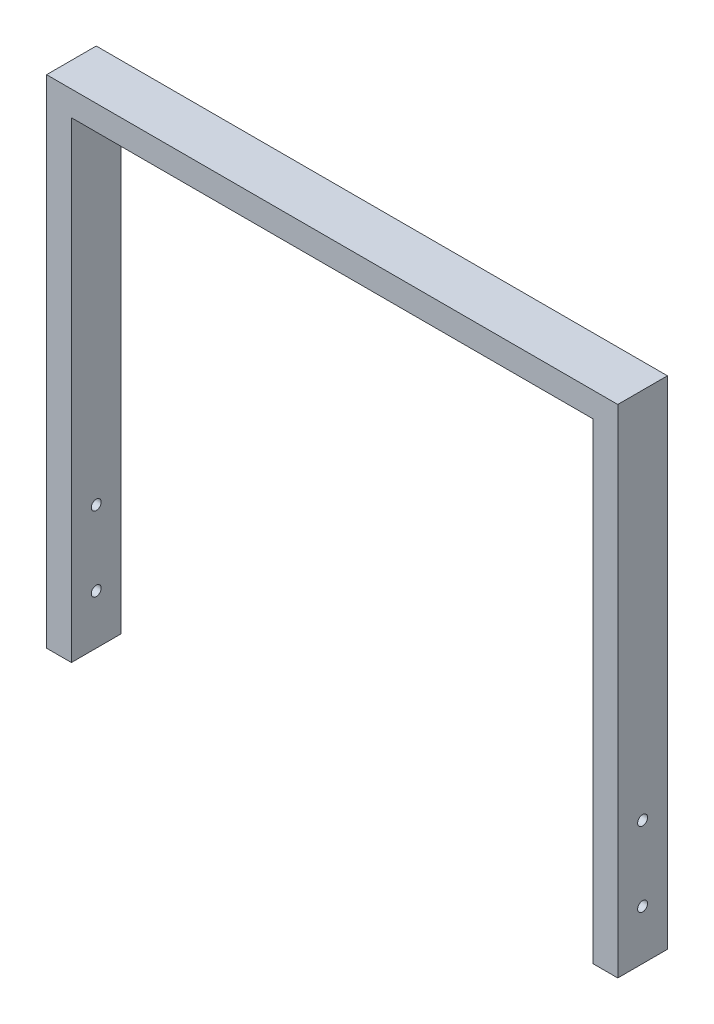
ISO-10303-21;
HEADER;
FILE_DESCRIPTION(('STEP AP214'),'2;1');
FILE_NAME('part.step','',(''),(''),'','','');
FILE_SCHEMA(('AUTOMOTIVE_DESIGN { 1 0 10303 214 1 1 1 1 }'));
ENDSEC;
DATA;
#1=APPLICATION_CONTEXT('core data for automotive mechanical design processes');
#2=APPLICATION_PROTOCOL_DEFINITION('international standard','automotive_design',2000,#1);
#3=PRODUCT_CONTEXT('',#1,'mechanical');
#4=PRODUCT('Part','Part','',(#3));
#5=PRODUCT_RELATED_PRODUCT_CATEGORY('part','',(#4));
#6=PRODUCT_DEFINITION_FORMATION('','',#4);
#7=PRODUCT_DEFINITION_CONTEXT('part definition',#1,'design');
#8=PRODUCT_DEFINITION('design','',#6,#7);
#9=PRODUCT_DEFINITION_SHAPE('','',#8);
#10=(LENGTH_UNIT() NAMED_UNIT(*) SI_UNIT(.MILLI.,.METRE.));
#11=(NAMED_UNIT(*) PLANE_ANGLE_UNIT() SI_UNIT($,.RADIAN.));
#12=(NAMED_UNIT(*) SI_UNIT($,.STERADIAN.) SOLID_ANGLE_UNIT());
#13=UNCERTAINTY_MEASURE_WITH_UNIT(LENGTH_MEASURE(1.E-05),#10,'distance_accuracy_value','');
#14=(GEOMETRIC_REPRESENTATION_CONTEXT(3) GLOBAL_UNCERTAINTY_ASSIGNED_CONTEXT((#13)) GLOBAL_UNIT_ASSIGNED_CONTEXT((#10,
#11,#12)) REPRESENTATION_CONTEXT('',''));
#15=CARTESIAN_POINT('',(0.,0.,0.));
#16=DIRECTION('',(0.,0.,1.));
#17=DIRECTION('',(1.,0.,0.));
#18=AXIS2_PLACEMENT_3D('',#15,#16,#17);
#19=CARTESIAN_POINT('',(10.,0.,10.));
#20=DIRECTION('',(0.,1.,0.));
#21=DIRECTION('',(-1.,0.,0.));
#22=AXIS2_PLACEMENT_3D('',#19,#20,#21);
#23=PLANE('',#22);
#24=DIRECTION('',(1.,0.,0.));
#25=VECTOR('',#24,1.);
#26=CARTESIAN_POINT('',(10.,0.,-10.));
#27=LINE('',#26,#25);
#28=CARTESIAN_POINT('',(0.,0.,-10.));
#29=VERTEX_POINT('',#28);
#30=CARTESIAN_POINT('',(10.,0.,-10.));
#31=VERTEX_POINT('',#30);
#32=EDGE_CURVE('E143',#29,#31,#27,.T.);
#33=ORIENTED_EDGE('',*,*,#32,.T.);
#34=DIRECTION('',(0.,0.,-1.));
#35=VECTOR('',#34,1.);
#36=CARTESIAN_POINT('',(10.,0.,10.));
#37=LINE('',#36,#35);
#38=CARTESIAN_POINT('',(10.,0.,10.));
#39=VERTEX_POINT('',#38);
#40=EDGE_CURVE('E11',#39,#31,#37,.T.);
#41=ORIENTED_EDGE('',*,*,#40,.F.);
#42=DIRECTION('',(1.,0.,0.));
#43=VECTOR('',#42,1.);
#44=CARTESIAN_POINT('',(10.,0.,10.));
#45=LINE('',#44,#43);
#46=CARTESIAN_POINT('',(0.,0.,10.));
#47=VERTEX_POINT('',#46);
#48=EDGE_CURVE('E166',#47,#39,#45,.T.);
#49=ORIENTED_EDGE('',*,*,#48,.F.);
#50=DIRECTION('',(0.,0.,-1.));
#51=VECTOR('',#50,1.);
#52=CARTESIAN_POINT('',(0.,0.,10.));
#53=LINE('',#52,#51);
#54=EDGE_CURVE('E139',#47,#29,#53,.T.);
#55=ORIENTED_EDGE('',*,*,#54,.T.);
#56=EDGE_LOOP('',(#33,#41,#49,#55));
#57=FACE_BOUND('',#56,.T.);
#58=ADVANCED_FACE('F42',(#57),#23,.F.);
#59=CARTESIAN_POINT('',(9.99999999999998,190.,10.));
#60=DIRECTION('',(-1.,0.,0.));
#61=DIRECTION('',(0.,-1.,0.));
#62=AXIS2_PLACEMENT_3D('',#59,#60,#61);
#63=PLANE('',#62);
#64=CARTESIAN_POINT('',(10.,20.,0.));
#65=DIRECTION('',(-1.,0.,0.));
#66=DIRECTION('',(0.,-1.,0.));
#67=AXIS2_PLACEMENT_3D('',#64,#65,#66);
#68=CIRCLE('',#67,2.);
#69=CARTESIAN_POINT('',(10.,20.,2.));
#70=VERTEX_POINT('',#69);
#71=EDGE_CURVE('E148',#70,#70,#68,.T.);
#72=ORIENTED_EDGE('',*,*,#71,.T.);
#73=EDGE_LOOP('',(#72));
#74=FACE_BOUND('',#73,.T.);
#75=CARTESIAN_POINT('',(10.,50.,0.));
#76=DIRECTION('',(-1.,0.,0.));
#77=DIRECTION('',(0.,-1.,0.));
#78=AXIS2_PLACEMENT_3D('',#75,#76,#77);
#79=CIRCLE('',#78,2.);
#80=CARTESIAN_POINT('',(10.,50.,2.));
#81=VERTEX_POINT('',#80);
#82=EDGE_CURVE('E217',#81,#81,#79,.T.);
#83=ORIENTED_EDGE('',*,*,#82,.T.);
#84=EDGE_LOOP('',(#83));
#85=FACE_BOUND('',#84,.T.);
#86=DIRECTION('',(0.,1.,0.));
#87=VECTOR('',#86,1.);
#88=CARTESIAN_POINT('',(9.99999999999998,190.,-10.));
#89=LINE('',#88,#87);
#90=CARTESIAN_POINT('',(9.99999999999998,190.,-10.));
#91=VERTEX_POINT('',#90);
#92=EDGE_CURVE('E147',#31,#91,#89,.T.);
#93=ORIENTED_EDGE('',*,*,#92,.T.);
#94=DIRECTION('',(0.,0.,-1.));
#95=VECTOR('',#94,1.);
#96=CARTESIAN_POINT('',(9.99999999999998,190.,10.));
#97=LINE('',#96,#95);
#98=CARTESIAN_POINT('',(9.99999999999998,190.,10.));
#99=VERTEX_POINT('',#98);
#100=EDGE_CURVE('E51',#99,#91,#97,.T.);
#101=ORIENTED_EDGE('',*,*,#100,.F.);
#102=DIRECTION('',(0.,1.,0.));
#103=VECTOR('',#102,1.);
#104=CARTESIAN_POINT('',(9.99999999999998,190.,10.));
#105=LINE('',#104,#103);
#106=EDGE_CURVE('E102',#39,#99,#105,.T.);
#107=ORIENTED_EDGE('',*,*,#106,.F.);
#108=ORIENTED_EDGE('',*,*,#40,.T.);
#109=EDGE_LOOP('',(#93,#101,#107,#108));
#110=FACE_BOUND('',#109,.T.);
#111=ADVANCED_FACE('F270',(#74,#85,#110),#63,.F.);
#112=CARTESIAN_POINT('',(220.,190.,10.));
#113=DIRECTION('',(0.,1.,0.));
#114=DIRECTION('',(-1.,0.,0.));
#115=AXIS2_PLACEMENT_3D('',#112,#113,#114);
#116=PLANE('',#115);
#117=DIRECTION('',(1.,0.,0.));
#118=VECTOR('',#117,1.);
#119=CARTESIAN_POINT('',(220.,190.,-10.));
#120=LINE('',#119,#118);
#121=CARTESIAN_POINT('',(220.,190.,-10.));
#122=VERTEX_POINT('',#121);
#123=EDGE_CURVE('E151',#91,#122,#120,.T.);
#124=ORIENTED_EDGE('',*,*,#123,.T.);
#125=DIRECTION('',(0.,0.,-1.));
#126=VECTOR('',#125,1.);
#127=CARTESIAN_POINT('',(220.,190.,10.));
#128=LINE('',#127,#126);
#129=CARTESIAN_POINT('',(220.,190.,10.));
#130=VERTEX_POINT('',#129);
#131=EDGE_CURVE('E177',#130,#122,#128,.T.);
#132=ORIENTED_EDGE('',*,*,#131,.F.);
#133=DIRECTION('',(1.,0.,0.));
#134=VECTOR('',#133,1.);
#135=CARTESIAN_POINT('',(220.,190.,10.));
#136=LINE('',#135,#134);
#137=EDGE_CURVE('E187',#99,#130,#136,.T.);
#138=ORIENTED_EDGE('',*,*,#137,.F.);
#139=ORIENTED_EDGE('',*,*,#100,.T.);
#140=EDGE_LOOP('',(#124,#132,#138,#139));
#141=FACE_BOUND('',#140,.T.);
#142=ADVANCED_FACE('F185',(#141),#116,.F.);
#143=CARTESIAN_POINT('',(220.,0.,10.));
#144=DIRECTION('',(1.,0.,0.));
#145=DIRECTION('',(0.,0.,-1.));
#146=AXIS2_PLACEMENT_3D('',#143,#144,#145);
#147=PLANE('',#146);
#148=CARTESIAN_POINT('',(220.,20.,0.));
#149=DIRECTION('',(1.,0.,0.));
#150=DIRECTION('',(0.,0.,-1.));
#151=AXIS2_PLACEMENT_3D('',#148,#149,#150);
#152=CIRCLE('',#151,2.);
#153=CARTESIAN_POINT('',(220.,20.,2.));
#154=VERTEX_POINT('',#153);
#155=EDGE_CURVE('E213',#154,#154,#152,.T.);
#156=ORIENTED_EDGE('',*,*,#155,.T.);
#157=EDGE_LOOP('',(#156));
#158=FACE_BOUND('',#157,.T.);
#159=CARTESIAN_POINT('',(220.,50.,0.));
#160=DIRECTION('',(1.,0.,0.));
#161=DIRECTION('',(0.,0.,-1.));
#162=AXIS2_PLACEMENT_3D('',#159,#160,#161);
#163=CIRCLE('',#162,2.);
#164=CARTESIAN_POINT('',(220.,50.,2.));
#165=VERTEX_POINT('',#164);
#166=EDGE_CURVE('E221',#165,#165,#163,.T.);
#167=ORIENTED_EDGE('',*,*,#166,.T.);
#168=EDGE_LOOP('',(#167));
#169=FACE_BOUND('',#168,.T.);
#170=DIRECTION('',(0.,-1.,0.));
#171=VECTOR('',#170,1.);
#172=CARTESIAN_POINT('',(220.,0.,-10.));
#173=LINE('',#172,#171);
#174=CARTESIAN_POINT('',(220.,0.,-10.));
#175=VERTEX_POINT('',#174);
#176=EDGE_CURVE('E154',#122,#175,#173,.T.);
#177=ORIENTED_EDGE('',*,*,#176,.T.);
#178=DIRECTION('',(0.,0.,-1.));
#179=VECTOR('',#178,1.);
#180=CARTESIAN_POINT('',(220.,0.,10.));
#181=LINE('',#180,#179);
#182=CARTESIAN_POINT('',(220.,0.,10.));
#183=VERTEX_POINT('',#182);
#184=EDGE_CURVE('E173',#183,#175,#181,.T.);
#185=ORIENTED_EDGE('',*,*,#184,.F.);
#186=DIRECTION('',(0.,-1.,0.));
#187=VECTOR('',#186,1.);
#188=CARTESIAN_POINT('',(220.,0.,10.));
#189=LINE('',#188,#187);
#190=EDGE_CURVE('E200',#130,#183,#189,.T.);
#191=ORIENTED_EDGE('',*,*,#190,.F.);
#192=ORIENTED_EDGE('',*,*,#131,.T.);
#193=EDGE_LOOP('',(#177,#185,#191,#192));
#194=FACE_BOUND('',#193,.T.);
#195=ADVANCED_FACE('F195',(#158,#169,#194),#147,.F.);
#196=CARTESIAN_POINT('',(230.,0.,10.));
#197=DIRECTION('',(0.,1.,0.));
#198=DIRECTION('',(-1.,0.,0.));
#199=AXIS2_PLACEMENT_3D('',#196,#197,#198);
#200=PLANE('',#199);
#201=DIRECTION('',(1.,0.,0.));
#202=VECTOR('',#201,1.);
#203=CARTESIAN_POINT('',(230.,0.,-10.));
#204=LINE('',#203,#202);
#205=CARTESIAN_POINT('',(230.,0.,-10.));
#206=VERTEX_POINT('',#205);
#207=EDGE_CURVE('E157',#175,#206,#204,.T.);
#208=ORIENTED_EDGE('',*,*,#207,.T.);
#209=DIRECTION('',(0.,0.,-1.));
#210=VECTOR('',#209,1.);
#211=CARTESIAN_POINT('',(230.,0.,10.));
#212=LINE('',#211,#210);
#213=CARTESIAN_POINT('',(230.,0.,10.));
#214=VERTEX_POINT('',#213);
#215=EDGE_CURVE('E132',#214,#206,#212,.T.);
#216=ORIENTED_EDGE('',*,*,#215,.F.);
#217=DIRECTION('',(1.,0.,0.));
#218=VECTOR('',#217,1.);
#219=CARTESIAN_POINT('',(230.,0.,10.));
#220=LINE('',#219,#218);
#221=EDGE_CURVE('E121',#183,#214,#220,.T.);
#222=ORIENTED_EDGE('',*,*,#221,.F.);
#223=ORIENTED_EDGE('',*,*,#184,.T.);
#224=EDGE_LOOP('',(#208,#216,#222,#223));
#225=FACE_BOUND('',#224,.T.);
#226=ADVANCED_FACE('F198',(#225),#200,.F.);
#227=CARTESIAN_POINT('',(230.,200.,10.));
#228=DIRECTION('',(-1.,0.,0.));
#229=DIRECTION('',(0.,-1.,0.));
#230=AXIS2_PLACEMENT_3D('',#227,#228,#229);
#231=PLANE('',#230);
#232=CARTESIAN_POINT('',(230.,20.,0.));
#233=DIRECTION('',(-1.,0.,0.));
#234=DIRECTION('',(0.,0.,1.));
#235=AXIS2_PLACEMENT_3D('',#232,#233,#234);
#236=CIRCLE('',#235,2.);
#237=CARTESIAN_POINT('',(230.,20.,2.));
#238=VERTEX_POINT('',#237);
#239=EDGE_CURVE('E225',#238,#238,#236,.T.);
#240=ORIENTED_EDGE('',*,*,#239,.T.);
#241=EDGE_LOOP('',(#240));
#242=FACE_BOUND('',#241,.T.);
#243=CARTESIAN_POINT('',(230.,50.,0.));
#244=DIRECTION('',(-1.,0.,0.));
#245=DIRECTION('',(0.,0.,1.));
#246=AXIS2_PLACEMENT_3D('',#243,#244,#245);
#247=CIRCLE('',#246,2.);
#248=CARTESIAN_POINT('',(230.,50.,2.));
#249=VERTEX_POINT('',#248);
#250=EDGE_CURVE('E226',#249,#249,#247,.T.);
#251=ORIENTED_EDGE('',*,*,#250,.T.);
#252=EDGE_LOOP('',(#251));
#253=FACE_BOUND('',#252,.T.);
#254=DIRECTION('',(0.,1.,0.));
#255=VECTOR('',#254,1.);
#256=CARTESIAN_POINT('',(230.,200.,-10.));
#257=LINE('',#256,#255);
#258=CARTESIAN_POINT('',(230.,200.,-10.));
#259=VERTEX_POINT('',#258);
#260=EDGE_CURVE('E130',#206,#259,#257,.T.);
#261=ORIENTED_EDGE('',*,*,#260,.T.);
#262=DIRECTION('',(0.,0.,-1.));
#263=VECTOR('',#262,1.);
#264=CARTESIAN_POINT('',(230.,200.,10.));
#265=LINE('',#264,#263);
#266=CARTESIAN_POINT('',(230.,200.,10.));
#267=VERTEX_POINT('',#266);
#268=EDGE_CURVE('E127',#267,#259,#265,.T.);
#269=ORIENTED_EDGE('',*,*,#268,.F.);
#270=DIRECTION('',(0.,1.,0.));
#271=VECTOR('',#270,1.);
#272=CARTESIAN_POINT('',(230.,200.,10.));
#273=LINE('',#272,#271);
#274=EDGE_CURVE('E115',#214,#267,#273,.T.);
#275=ORIENTED_EDGE('',*,*,#274,.F.);
#276=ORIENTED_EDGE('',*,*,#215,.T.);
#277=EDGE_LOOP('',(#261,#269,#275,#276));
#278=FACE_BOUND('',#277,.T.);
#279=ADVANCED_FACE('F128',(#242,#253,#278),#231,.F.);
#280=CARTESIAN_POINT('',(0.,200.,10.));
#281=DIRECTION('',(0.,-1.,0.));
#282=DIRECTION('',(0.,0.,-1.));
#283=AXIS2_PLACEMENT_3D('',#280,#281,#282);
#284=PLANE('',#283);
#285=DIRECTION('',(-1.,0.,0.));
#286=VECTOR('',#285,1.);
#287=CARTESIAN_POINT('',(0.,200.,-10.));
#288=LINE('',#287,#286);
#289=CARTESIAN_POINT('',(0.,200.,-10.));
#290=VERTEX_POINT('',#289);
#291=EDGE_CURVE('E88',#259,#290,#288,.T.);
#292=ORIENTED_EDGE('',*,*,#291,.T.);
#293=DIRECTION('',(0.,0.,-1.));
#294=VECTOR('',#293,1.);
#295=CARTESIAN_POINT('',(0.,200.,10.));
#296=LINE('',#295,#294);
#297=CARTESIAN_POINT('',(0.,200.,10.));
#298=VERTEX_POINT('',#297);
#299=EDGE_CURVE('E133',#298,#290,#296,.T.);
#300=ORIENTED_EDGE('',*,*,#299,.F.);
#301=DIRECTION('',(-1.,0.,0.));
#302=VECTOR('',#301,1.);
#303=CARTESIAN_POINT('',(0.,200.,10.));
#304=LINE('',#303,#302);
#305=EDGE_CURVE('E119',#267,#298,#304,.T.);
#306=ORIENTED_EDGE('',*,*,#305,.F.);
#307=ORIENTED_EDGE('',*,*,#268,.T.);
#308=EDGE_LOOP('',(#292,#300,#306,#307));
#309=FACE_BOUND('',#308,.T.);
#310=ADVANCED_FACE('F135',(#309),#284,.F.);
#311=CARTESIAN_POINT('',(0.,0.,10.));
#312=DIRECTION('',(1.,0.,0.));
#313=DIRECTION('',(0.,0.,-1.));
#314=AXIS2_PLACEMENT_3D('',#311,#312,#313);
#315=PLANE('',#314);
#316=CARTESIAN_POINT('',(0.,20.,0.));
#317=DIRECTION('',(-1.,0.,0.));
#318=DIRECTION('',(0.,0.,1.));
#319=AXIS2_PLACEMENT_3D('',#316,#317,#318);
#320=CIRCLE('',#319,2.);
#321=CARTESIAN_POINT('',(0.,20.,2.));
#322=VERTEX_POINT('',#321);
#323=EDGE_CURVE('E234',#322,#322,#320,.T.);
#324=ORIENTED_EDGE('',*,*,#323,.F.);
#325=EDGE_LOOP('',(#324));
#326=FACE_BOUND('',#325,.T.);
#327=CARTESIAN_POINT('',(0.,50.,0.));
#328=DIRECTION('',(-1.,0.,0.));
#329=DIRECTION('',(0.,0.,1.));
#330=AXIS2_PLACEMENT_3D('',#327,#328,#329);
#331=CIRCLE('',#330,2.);
#332=CARTESIAN_POINT('',(0.,50.,2.));
#333=VERTEX_POINT('',#332);
#334=EDGE_CURVE('E230',#333,#333,#331,.T.);
#335=ORIENTED_EDGE('',*,*,#334,.F.);
#336=EDGE_LOOP('',(#335));
#337=FACE_BOUND('',#336,.T.);
#338=DIRECTION('',(0.,-1.,0.));
#339=VECTOR('',#338,1.);
#340=CARTESIAN_POINT('',(0.,0.,-10.));
#341=LINE('',#340,#339);
#342=EDGE_CURVE('E94',#290,#29,#341,.T.);
#343=ORIENTED_EDGE('',*,*,#342,.T.);
#344=ORIENTED_EDGE('',*,*,#54,.F.);
#345=DIRECTION('',(0.,-1.,0.));
#346=VECTOR('',#345,1.);
#347=CARTESIAN_POINT('',(0.,0.,10.));
#348=LINE('',#347,#346);
#349=EDGE_CURVE('E59',#298,#47,#348,.T.);
#350=ORIENTED_EDGE('',*,*,#349,.F.);
#351=ORIENTED_EDGE('',*,*,#299,.T.);
#352=EDGE_LOOP('',(#343,#344,#350,#351));
#353=FACE_BOUND('',#352,.T.);
#354=ADVANCED_FACE('F278',(#326,#337,#353),#315,.F.);
#355=CARTESIAN_POINT('',(0.,0.,10.));
#356=DIRECTION('',(0.,0.,-1.));
#357=DIRECTION('',(-1.,0.,0.));
#358=AXIS2_PLACEMENT_3D('',#355,#356,#357);
#359=PLANE('',#358);
#360=ORIENTED_EDGE('',*,*,#48,.T.);
#361=ORIENTED_EDGE('',*,*,#106,.T.);
#362=ORIENTED_EDGE('',*,*,#137,.T.);
#363=ORIENTED_EDGE('',*,*,#190,.T.);
#364=ORIENTED_EDGE('',*,*,#221,.T.);
#365=ORIENTED_EDGE('',*,*,#274,.T.);
#366=ORIENTED_EDGE('',*,*,#305,.T.);
#367=ORIENTED_EDGE('',*,*,#349,.T.);
#368=EDGE_LOOP('',(#360,#361,#362,#363,#364,#365,#366,#367));
#369=FACE_BOUND('',#368,.T.);
#370=ADVANCED_FACE('F117',(#369),#359,.F.);
#371=CARTESIAN_POINT('',(0.,0.,-10.));
#372=DIRECTION('',(0.,0.,-1.));
#373=DIRECTION('',(-1.,0.,0.));
#374=AXIS2_PLACEMENT_3D('',#371,#372,#373);
#375=PLANE('',#374);
#376=ORIENTED_EDGE('',*,*,#32,.F.);
#377=ORIENTED_EDGE('',*,*,#342,.F.);
#378=ORIENTED_EDGE('',*,*,#291,.F.);
#379=ORIENTED_EDGE('',*,*,#260,.F.);
#380=ORIENTED_EDGE('',*,*,#207,.F.);
#381=ORIENTED_EDGE('',*,*,#176,.F.);
#382=ORIENTED_EDGE('',*,*,#123,.F.);
#383=ORIENTED_EDGE('',*,*,#92,.F.);
#384=EDGE_LOOP('',(#376,#377,#378,#379,#380,#381,#382,#383));
#385=FACE_BOUND('',#384,.T.);
#386=ADVANCED_FACE('F191',(#385),#375,.T.);
#387=CARTESIAN_POINT('',(230.,50.,0.));
#388=DIRECTION('',(-1.,0.,0.));
#389=DIRECTION('',(0.,0.,1.));
#390=AXIS2_PLACEMENT_3D('',#387,#388,#389);
#391=CYLINDRICAL_SURFACE('',#390,2.);
#392=CARTESIAN_POINT('',(0.,50.,2.));
#393=CARTESIAN_POINT('',(0.104166666666692,50.,2.));
#394=CARTESIAN_POINT('',(0.208333333333357,50.,2.));
#395=CARTESIAN_POINT('',(0.416666666666686,50.,2.));
#396=CARTESIAN_POINT('',(0.52083333333335,50.,2.));
#397=CARTESIAN_POINT('',(0.729166666666688,50.,2.));
#398=CARTESIAN_POINT('',(0.833333333333362,50.,2.));
#399=CARTESIAN_POINT('',(1.0416666666667,50.,2.));
#400=CARTESIAN_POINT('',(1.14583333333336,50.,2.));
#401=CARTESIAN_POINT('',(1.35416666666669,50.,2.));
#402=CARTESIAN_POINT('',(1.45833333333336,50.,2.));
#403=CARTESIAN_POINT('',(1.6666666666667,50.,2.));
#404=CARTESIAN_POINT('',(1.77083333333337,50.,2.));
#405=CARTESIAN_POINT('',(1.97916666666671,50.,2.));
#406=CARTESIAN_POINT('',(2.08333333333337,50.,2.));
#407=CARTESIAN_POINT('',(2.2916666666667,50.,2.));
#408=CARTESIAN_POINT('',(2.39583333333337,50.,2.));
#409=CARTESIAN_POINT('',(2.60416666666669,50.,2.));
#410=CARTESIAN_POINT('',(2.70833333333336,50.,2.));
#411=CARTESIAN_POINT('',(2.91666666666669,50.,2.));
#412=CARTESIAN_POINT('',(3.02083333333335,50.,2.));
#413=CARTESIAN_POINT('',(3.22916666666669,50.,2.));
#414=CARTESIAN_POINT('',(3.33333333333336,50.,2.));
#415=CARTESIAN_POINT('',(3.5416666666667,50.,2.));
#416=CARTESIAN_POINT('',(3.64583333333337,50.,2.));
#417=CARTESIAN_POINT('',(3.8541666666667,50.,2.));
#418=CARTESIAN_POINT('',(3.95833333333336,50.,2.));
#419=CARTESIAN_POINT('',(4.1666666666667,50.,2.));
#420=CARTESIAN_POINT('',(4.27083333333337,50.,2.));
#421=CARTESIAN_POINT('',(4.47916666666671,50.,2.));
#422=CARTESIAN_POINT('',(4.58333333333337,50.,2.));
#423=CARTESIAN_POINT('',(4.7916666666667,50.,2.));
#424=CARTESIAN_POINT('',(4.89583333333337,50.,2.));
#425=CARTESIAN_POINT('',(5.1041666666667,50.,2.));
#426=CARTESIAN_POINT('',(5.20833333333336,50.,2.));
#427=CARTESIAN_POINT('',(5.41666666666669,50.,2.));
#428=CARTESIAN_POINT('',(5.52083333333335,50.,2.));
#429=CARTESIAN_POINT('',(5.72916666666669,50.,2.));
#430=CARTESIAN_POINT('',(5.83333333333337,50.,2.));
#431=CARTESIAN_POINT('',(6.0416666666667,50.,2.));
#432=CARTESIAN_POINT('',(6.14583333333337,50.,2.));
#433=CARTESIAN_POINT('',(6.3541666666667,50.,2.));
#434=CARTESIAN_POINT('',(6.45833333333336,50.,2.));
#435=CARTESIAN_POINT('',(6.6666666666667,50.,2.));
#436=CARTESIAN_POINT('',(6.77083333333337,50.,2.));
#437=CARTESIAN_POINT('',(6.97916666666671,50.,2.));
#438=CARTESIAN_POINT('',(7.08333333333338,50.,2.));
#439=CARTESIAN_POINT('',(7.29166666666671,50.,2.));
#440=CARTESIAN_POINT('',(7.39583333333337,50.,2.));
#441=CARTESIAN_POINT('',(7.6041666666667,50.,2.));
#442=CARTESIAN_POINT('',(7.70833333333336,50.,2.));
#443=CARTESIAN_POINT('',(7.91666666666669,50.,2.));
#444=CARTESIAN_POINT('',(8.02083333333336,50.,2.));
#445=CARTESIAN_POINT('',(8.22916666666669,50.,2.));
#446=CARTESIAN_POINT('',(8.33333333333337,50.,2.));
#447=CARTESIAN_POINT('',(8.54166666666671,50.,2.));
#448=CARTESIAN_POINT('',(8.64583333333337,50.,2.));
#449=CARTESIAN_POINT('',(8.8541666666667,50.,2.));
#450=CARTESIAN_POINT('',(8.95833333333336,50.,2.));
#451=CARTESIAN_POINT('',(9.1666666666667,50.,2.));
#452=CARTESIAN_POINT('',(9.27083333333338,50.,2.));
#453=CARTESIAN_POINT('',(9.47916666666671,50.,2.));
#454=CARTESIAN_POINT('',(9.58333333333338,50.,2.));
#455=CARTESIAN_POINT('',(9.79166666666671,50.,2.));
#456=CARTESIAN_POINT('',(9.89583333333337,50.,2.));
#457=CARTESIAN_POINT('',(10.,50.,2.));
#458=B_SPLINE_CURVE_WITH_KNOTS('',3,(#392,#393,#394,#395,#396,#397,#398,#399,#400,#401,#402,
#403,#404,#405,#406,#407,#408,#409,#410,#411,#412,#413,#414,#415,#416,#417,#418,#419,#420,#421,
#422,#423,#424,#425,#426,#427,#428,#429,#430,#431,#432,#433,#434,#435,#436,#437,#438,#439,#440,
#441,#442,#443,#444,#445,#446,#447,#448,#449,#450,#451,#452,#453,#454,#455,#456,#457),
.UNSPECIFIED.,.F.,.F.,(4,2,2,2,2,2,2,2,2,2,2,2,2,2,2,2,2,2,2,2,2,2,2,2,2,2,2,2,2,2,2,2,4),(0.,
0.312499999999993,0.624999999999987,0.937500000000008,1.25,1.56249999999999,1.87500000000002,
2.18750000000001,2.5,2.8125,3.12499999999999,3.43750000000001,3.75,4.0625,4.37500000000002,
4.68750000000001,5.,5.3125,5.62499999999999,5.93750000000001,6.25000000000001,6.5625,
6.87500000000002,7.18750000000001,7.50000000000001,7.8125,8.12499999999999,8.43750000000001,
8.75000000000001,9.0625,9.37500000000002,9.68750000000002,10.),.UNSPECIFIED.);
#459=EDGE_CURVE('BSEAM260',#333,#81,#458,.T.);
#460=ORIENTED_EDGE('',*,*,#334,.T.);
#461=ORIENTED_EDGE('',*,*,#82,.F.);
#462=ORIENTED_EDGE('',*,*,#459,.T.);
#463=ORIENTED_EDGE('',*,*,#459,.F.);
#464=EDGE_LOOP('',(#460,#462,#461,#463));
#465=FACE_BOUND('',#464,.T.);
#466=ADVANCED_FACE('F260',(#465),#391,.F.);
#467=CARTESIAN_POINT('',(230.,20.,0.));
#468=DIRECTION('',(-1.,0.,0.));
#469=DIRECTION('',(0.,0.,1.));
#470=AXIS2_PLACEMENT_3D('',#467,#468,#469);
#471=CYLINDRICAL_SURFACE('',#470,2.);
#472=CARTESIAN_POINT('',(0.,20.,2.));
#473=CARTESIAN_POINT('',(0.104166666666692,20.,2.));
#474=CARTESIAN_POINT('',(0.208333333333357,20.,2.));
#475=CARTESIAN_POINT('',(0.416666666666686,20.,2.));
#476=CARTESIAN_POINT('',(0.52083333333335,20.,2.));
#477=CARTESIAN_POINT('',(0.729166666666688,20.,2.));
#478=CARTESIAN_POINT('',(0.833333333333362,20.,2.));
#479=CARTESIAN_POINT('',(1.0416666666667,20.,2.));
#480=CARTESIAN_POINT('',(1.14583333333336,20.,2.));
#481=CARTESIAN_POINT('',(1.35416666666669,20.,2.));
#482=CARTESIAN_POINT('',(1.45833333333336,20.,2.));
#483=CARTESIAN_POINT('',(1.6666666666667,20.,2.));
#484=CARTESIAN_POINT('',(1.77083333333337,20.,2.));
#485=CARTESIAN_POINT('',(1.97916666666671,20.,2.));
#486=CARTESIAN_POINT('',(2.08333333333337,20.,2.));
#487=CARTESIAN_POINT('',(2.2916666666667,20.,2.));
#488=CARTESIAN_POINT('',(2.39583333333337,20.,2.));
#489=CARTESIAN_POINT('',(2.60416666666669,20.,2.));
#490=CARTESIAN_POINT('',(2.70833333333336,20.,2.));
#491=CARTESIAN_POINT('',(2.91666666666669,20.,2.));
#492=CARTESIAN_POINT('',(3.02083333333335,20.,2.));
#493=CARTESIAN_POINT('',(3.22916666666669,20.,2.));
#494=CARTESIAN_POINT('',(3.33333333333336,20.,2.));
#495=CARTESIAN_POINT('',(3.5416666666667,20.,2.));
#496=CARTESIAN_POINT('',(3.64583333333337,20.,2.));
#497=CARTESIAN_POINT('',(3.8541666666667,20.,2.));
#498=CARTESIAN_POINT('',(3.95833333333336,20.,2.));
#499=CARTESIAN_POINT('',(4.1666666666667,20.,2.));
#500=CARTESIAN_POINT('',(4.27083333333337,20.,2.));
#501=CARTESIAN_POINT('',(4.47916666666671,20.,2.));
#502=CARTESIAN_POINT('',(4.58333333333337,20.,2.));
#503=CARTESIAN_POINT('',(4.7916666666667,20.,2.));
#504=CARTESIAN_POINT('',(4.89583333333337,20.,2.));
#505=CARTESIAN_POINT('',(5.1041666666667,20.,2.));
#506=CARTESIAN_POINT('',(5.20833333333336,20.,2.));
#507=CARTESIAN_POINT('',(5.41666666666669,20.,2.));
#508=CARTESIAN_POINT('',(5.52083333333335,20.,2.));
#509=CARTESIAN_POINT('',(5.72916666666669,20.,2.));
#510=CARTESIAN_POINT('',(5.83333333333337,20.,2.));
#511=CARTESIAN_POINT('',(6.0416666666667,20.,2.));
#512=CARTESIAN_POINT('',(6.14583333333337,20.,2.));
#513=CARTESIAN_POINT('',(6.3541666666667,20.,2.));
#514=CARTESIAN_POINT('',(6.45833333333336,20.,2.));
#515=CARTESIAN_POINT('',(6.6666666666667,20.,2.));
#516=CARTESIAN_POINT('',(6.77083333333337,20.,2.));
#517=CARTESIAN_POINT('',(6.97916666666671,20.,2.));
#518=CARTESIAN_POINT('',(7.08333333333338,20.,2.));
#519=CARTESIAN_POINT('',(7.29166666666671,20.,2.));
#520=CARTESIAN_POINT('',(7.39583333333337,20.,2.));
#521=CARTESIAN_POINT('',(7.6041666666667,20.,2.));
#522=CARTESIAN_POINT('',(7.70833333333336,20.,2.));
#523=CARTESIAN_POINT('',(7.91666666666669,20.,2.));
#524=CARTESIAN_POINT('',(8.02083333333336,20.,2.));
#525=CARTESIAN_POINT('',(8.22916666666669,20.,2.));
#526=CARTESIAN_POINT('',(8.33333333333337,20.,2.));
#527=CARTESIAN_POINT('',(8.54166666666671,20.,2.));
#528=CARTESIAN_POINT('',(8.64583333333337,20.,2.));
#529=CARTESIAN_POINT('',(8.8541666666667,20.,2.));
#530=CARTESIAN_POINT('',(8.95833333333336,20.,2.));
#531=CARTESIAN_POINT('',(9.1666666666667,20.,2.));
#532=CARTESIAN_POINT('',(9.27083333333338,20.,2.));
#533=CARTESIAN_POINT('',(9.47916666666671,20.,2.));
#534=CARTESIAN_POINT('',(9.58333333333338,20.,2.));
#535=CARTESIAN_POINT('',(9.79166666666671,20.,2.));
#536=CARTESIAN_POINT('',(9.89583333333337,20.,2.));
#537=CARTESIAN_POINT('',(10.,20.,2.));
#538=B_SPLINE_CURVE_WITH_KNOTS('',3,(#472,#473,#474,#475,#476,#477,#478,#479,#480,#481,#482,
#483,#484,#485,#486,#487,#488,#489,#490,#491,#492,#493,#494,#495,#496,#497,#498,#499,#500,#501,
#502,#503,#504,#505,#506,#507,#508,#509,#510,#511,#512,#513,#514,#515,#516,#517,#518,#519,#520,
#521,#522,#523,#524,#525,#526,#527,#528,#529,#530,#531,#532,#533,#534,#535,#536,#537),
.UNSPECIFIED.,.F.,.F.,(4,2,2,2,2,2,2,2,2,2,2,2,2,2,2,2,2,2,2,2,2,2,2,2,2,2,2,2,2,2,2,2,4),(0.,
0.312499999999993,0.624999999999987,0.937500000000008,1.25,1.56249999999999,1.87500000000002,
2.18750000000001,2.5,2.8125,3.12499999999999,3.43750000000001,3.75,4.0625,4.37500000000002,
4.68750000000001,5.,5.3125,5.62499999999999,5.93750000000001,6.25000000000001,6.5625,
6.87500000000002,7.18750000000001,7.50000000000001,7.8125,8.12499999999999,8.43750000000001,
8.75000000000001,9.0625,9.37500000000002,9.68750000000002,10.),.UNSPECIFIED.);
#539=EDGE_CURVE('BSEAM249',#322,#70,#538,.T.);
#540=ORIENTED_EDGE('',*,*,#323,.T.);
#541=ORIENTED_EDGE('',*,*,#71,.F.);
#542=ORIENTED_EDGE('',*,*,#539,.T.);
#543=ORIENTED_EDGE('',*,*,#539,.F.);
#544=EDGE_LOOP('',(#540,#542,#541,#543));
#545=FACE_BOUND('',#544,.T.);
#546=ADVANCED_FACE('F249',(#545),#471,.F.);
#547=CARTESIAN_POINT('',(230.,50.,2.));
#548=CARTESIAN_POINT('',(229.895833333333,50.,2.));
#549=CARTESIAN_POINT('',(229.791666666667,50.,2.));
#550=CARTESIAN_POINT('',(229.583333333333,50.,2.));
#551=CARTESIAN_POINT('',(229.479166666667,50.,2.));
#552=CARTESIAN_POINT('',(229.270833333333,50.,2.));
#553=CARTESIAN_POINT('',(229.166666666667,50.,2.));
#554=CARTESIAN_POINT('',(228.958333333333,50.,2.));
#555=CARTESIAN_POINT('',(228.854166666667,50.,2.));
#556=CARTESIAN_POINT('',(228.645833333333,50.,2.));
#557=CARTESIAN_POINT('',(228.541666666667,50.,2.));
#558=CARTESIAN_POINT('',(228.333333333333,50.,2.));
#559=CARTESIAN_POINT('',(228.229166666667,50.,2.));
#560=CARTESIAN_POINT('',(228.020833333333,50.,2.));
#561=CARTESIAN_POINT('',(227.916666666667,50.,2.));
#562=CARTESIAN_POINT('',(227.708333333333,50.,2.));
#563=CARTESIAN_POINT('',(227.604166666667,50.,2.));
#564=CARTESIAN_POINT('',(227.395833333333,50.,2.));
#565=CARTESIAN_POINT('',(227.291666666667,50.,2.));
#566=CARTESIAN_POINT('',(227.083333333333,50.,2.));
#567=CARTESIAN_POINT('',(226.979166666667,50.,2.));
#568=CARTESIAN_POINT('',(226.770833333333,50.,2.));
#569=CARTESIAN_POINT('',(226.666666666667,50.,2.));
#570=CARTESIAN_POINT('',(226.458333333333,50.,2.));
#571=CARTESIAN_POINT('',(226.354166666667,50.,2.));
#572=CARTESIAN_POINT('',(226.145833333333,50.,2.));
#573=CARTESIAN_POINT('',(226.041666666667,50.,2.));
#574=CARTESIAN_POINT('',(225.833333333333,50.,2.));
#575=CARTESIAN_POINT('',(225.729166666667,50.,2.));
#576=CARTESIAN_POINT('',(225.520833333333,50.,2.));
#577=CARTESIAN_POINT('',(225.416666666667,50.,2.));
#578=CARTESIAN_POINT('',(225.208333333333,50.,2.));
#579=CARTESIAN_POINT('',(225.104166666667,50.,2.));
#580=CARTESIAN_POINT('',(224.895833333333,50.,2.));
#581=CARTESIAN_POINT('',(224.791666666667,50.,2.));
#582=CARTESIAN_POINT('',(224.583333333333,50.,2.));
#583=CARTESIAN_POINT('',(224.479166666667,50.,2.));
#584=CARTESIAN_POINT('',(224.270833333333,50.,2.));
#585=CARTESIAN_POINT('',(224.166666666667,50.,2.));
#586=CARTESIAN_POINT('',(223.958333333333,50.,2.));
#587=CARTESIAN_POINT('',(223.854166666667,50.,2.));
#588=CARTESIAN_POINT('',(223.645833333333,50.,2.));
#589=CARTESIAN_POINT('',(223.541666666667,50.,2.));
#590=CARTESIAN_POINT('',(223.333333333333,50.,2.));
#591=CARTESIAN_POINT('',(223.229166666667,50.,2.));
#592=CARTESIAN_POINT('',(223.020833333333,50.,2.));
#593=CARTESIAN_POINT('',(222.916666666667,50.,2.));
#594=CARTESIAN_POINT('',(222.708333333333,50.,2.));
#595=CARTESIAN_POINT('',(222.604166666667,50.,2.));
#596=CARTESIAN_POINT('',(222.395833333333,50.,2.));
#597=CARTESIAN_POINT('',(222.291666666667,50.,2.));
#598=CARTESIAN_POINT('',(222.083333333333,50.,2.));
#599=CARTESIAN_POINT('',(221.979166666667,50.,2.));
#600=CARTESIAN_POINT('',(221.770833333333,50.,2.));
#601=CARTESIAN_POINT('',(221.666666666667,50.,2.));
#602=CARTESIAN_POINT('',(221.458333333333,50.,2.));
#603=CARTESIAN_POINT('',(221.354166666667,50.,2.));
#604=CARTESIAN_POINT('',(221.145833333333,50.,2.));
#605=CARTESIAN_POINT('',(221.041666666667,50.,2.));
#606=CARTESIAN_POINT('',(220.833333333333,50.,2.));
#607=CARTESIAN_POINT('',(220.729166666667,50.,2.));
#608=CARTESIAN_POINT('',(220.520833333333,50.,2.));
#609=CARTESIAN_POINT('',(220.416666666667,50.,2.));
#610=CARTESIAN_POINT('',(220.208333333333,50.,2.));
#611=CARTESIAN_POINT('',(220.104166666667,50.,2.));
#612=CARTESIAN_POINT('',(220.,50.,2.));
#613=B_SPLINE_CURVE_WITH_KNOTS('',3,(#547,#548,#549,#550,#551,#552,#553,#554,#555,#556,#557,
#558,#559,#560,#561,#562,#563,#564,#565,#566,#567,#568,#569,#570,#571,#572,#573,#574,#575,#576,
#577,#578,#579,#580,#581,#582,#583,#584,#585,#586,#587,#588,#589,#590,#591,#592,#593,#594,#595,
#596,#597,#598,#599,#600,#601,#602,#603,#604,#605,#606,#607,#608,#609,#610,#611,#612),
.UNSPECIFIED.,.F.,.F.,(4,2,2,2,2,2,2,2,2,2,2,2,2,2,2,2,2,2,2,2,2,2,2,2,2,2,2,2,2,2,2,2,4),(0.,
0.312500000000021,0.625000000000014,0.937500000000008,1.25000000000003,1.56250000000002,
1.87500000000002,2.18750000000001,2.50000000000003,2.81250000000002,3.12500000000002,
3.43750000000004,3.75000000000003,4.06250000000002,4.37500000000002,4.68750000000004,
5.00000000000003,5.31250000000003,5.62500000000005,5.93750000000004,6.25000000000003,
6.56250000000003,6.87500000000005,7.18750000000004,7.50000000000003,7.81250000000006,
8.12500000000005,8.43750000000004,8.75000000000004,9.06250000000006,9.37500000000005,
9.68750000000004,10.0000000000001),.UNSPECIFIED.);
#614=EDGE_CURVE('BSEAM247',#249,#165,#613,.T.);
#615=ORIENTED_EDGE('',*,*,#250,.F.);
#616=ORIENTED_EDGE('',*,*,#166,.F.);
#617=ORIENTED_EDGE('',*,*,#614,.T.);
#618=ORIENTED_EDGE('',*,*,#614,.F.);
#619=EDGE_LOOP('',(#615,#617,#616,#618));
#620=FACE_BOUND('',#619,.T.);
#621=ADVANCED_FACE('F247',(#620),#391,.F.);
#622=CARTESIAN_POINT('',(230.,20.,2.));
#623=CARTESIAN_POINT('',(229.895833333333,20.,2.));
#624=CARTESIAN_POINT('',(229.791666666667,20.,2.));
#625=CARTESIAN_POINT('',(229.583333333333,20.,2.));
#626=CARTESIAN_POINT('',(229.479166666667,20.,2.));
#627=CARTESIAN_POINT('',(229.270833333333,20.,2.));
#628=CARTESIAN_POINT('',(229.166666666667,20.,2.));
#629=CARTESIAN_POINT('',(228.958333333333,20.,2.));
#630=CARTESIAN_POINT('',(228.854166666667,20.,2.));
#631=CARTESIAN_POINT('',(228.645833333333,20.,2.));
#632=CARTESIAN_POINT('',(228.541666666667,20.,2.));
#633=CARTESIAN_POINT('',(228.333333333333,20.,2.));
#634=CARTESIAN_POINT('',(228.229166666667,20.,2.));
#635=CARTESIAN_POINT('',(228.020833333333,20.,2.));
#636=CARTESIAN_POINT('',(227.916666666667,20.,2.));
#637=CARTESIAN_POINT('',(227.708333333333,20.,2.));
#638=CARTESIAN_POINT('',(227.604166666667,20.,2.));
#639=CARTESIAN_POINT('',(227.395833333333,20.,2.));
#640=CARTESIAN_POINT('',(227.291666666667,20.,2.));
#641=CARTESIAN_POINT('',(227.083333333333,20.,2.));
#642=CARTESIAN_POINT('',(226.979166666667,20.,2.));
#643=CARTESIAN_POINT('',(226.770833333333,20.,2.));
#644=CARTESIAN_POINT('',(226.666666666667,20.,2.));
#645=CARTESIAN_POINT('',(226.458333333333,20.,2.));
#646=CARTESIAN_POINT('',(226.354166666667,20.,2.));
#647=CARTESIAN_POINT('',(226.145833333333,20.,2.));
#648=CARTESIAN_POINT('',(226.041666666667,20.,2.));
#649=CARTESIAN_POINT('',(225.833333333333,20.,2.));
#650=CARTESIAN_POINT('',(225.729166666667,20.,2.));
#651=CARTESIAN_POINT('',(225.520833333333,20.,2.));
#652=CARTESIAN_POINT('',(225.416666666667,20.,2.));
#653=CARTESIAN_POINT('',(225.208333333333,20.,2.));
#654=CARTESIAN_POINT('',(225.104166666667,20.,2.));
#655=CARTESIAN_POINT('',(224.895833333333,20.,2.));
#656=CARTESIAN_POINT('',(224.791666666667,20.,2.));
#657=CARTESIAN_POINT('',(224.583333333333,20.,2.));
#658=CARTESIAN_POINT('',(224.479166666667,20.,2.));
#659=CARTESIAN_POINT('',(224.270833333333,20.,2.));
#660=CARTESIAN_POINT('',(224.166666666667,20.,2.));
#661=CARTESIAN_POINT('',(223.958333333333,20.,2.));
#662=CARTESIAN_POINT('',(223.854166666667,20.,2.));
#663=CARTESIAN_POINT('',(223.645833333333,20.,2.));
#664=CARTESIAN_POINT('',(223.541666666667,20.,2.));
#665=CARTESIAN_POINT('',(223.333333333333,20.,2.));
#666=CARTESIAN_POINT('',(223.229166666667,20.,2.));
#667=CARTESIAN_POINT('',(223.020833333333,20.,2.));
#668=CARTESIAN_POINT('',(222.916666666667,20.,2.));
#669=CARTESIAN_POINT('',(222.708333333333,20.,2.));
#670=CARTESIAN_POINT('',(222.604166666667,20.,2.));
#671=CARTESIAN_POINT('',(222.395833333333,20.,2.));
#672=CARTESIAN_POINT('',(222.291666666667,20.,2.));
#673=CARTESIAN_POINT('',(222.083333333333,20.,2.));
#674=CARTESIAN_POINT('',(221.979166666667,20.,2.));
#675=CARTESIAN_POINT('',(221.770833333333,20.,2.));
#676=CARTESIAN_POINT('',(221.666666666667,20.,2.));
#677=CARTESIAN_POINT('',(221.458333333333,20.,2.));
#678=CARTESIAN_POINT('',(221.354166666667,20.,2.));
#679=CARTESIAN_POINT('',(221.145833333333,20.,2.));
#680=CARTESIAN_POINT('',(221.041666666667,20.,2.));
#681=CARTESIAN_POINT('',(220.833333333333,20.,2.));
#682=CARTESIAN_POINT('',(220.729166666667,20.,2.));
#683=CARTESIAN_POINT('',(220.520833333333,20.,2.));
#684=CARTESIAN_POINT('',(220.416666666667,20.,2.));
#685=CARTESIAN_POINT('',(220.208333333333,20.,2.));
#686=CARTESIAN_POINT('',(220.104166666667,20.,2.));
#687=CARTESIAN_POINT('',(220.,20.,2.));
#688=B_SPLINE_CURVE_WITH_KNOTS('',3,(#622,#623,#624,#625,#626,#627,#628,#629,#630,#631,#632,
#633,#634,#635,#636,#637,#638,#639,#640,#641,#642,#643,#644,#645,#646,#647,#648,#649,#650,#651,
#652,#653,#654,#655,#656,#657,#658,#659,#660,#661,#662,#663,#664,#665,#666,#667,#668,#669,#670,
#671,#672,#673,#674,#675,#676,#677,#678,#679,#680,#681,#682,#683,#684,#685,#686,#687),
.UNSPECIFIED.,.F.,.F.,(4,2,2,2,2,2,2,2,2,2,2,2,2,2,2,2,2,2,2,2,2,2,2,2,2,2,2,2,2,2,2,2,4),(0.,
0.312500000000021,0.625000000000014,0.937500000000008,1.25000000000003,1.56250000000002,
1.87500000000002,2.18750000000001,2.50000000000003,2.81250000000002,3.12500000000002,
3.43750000000004,3.75000000000003,4.06250000000002,4.37500000000002,4.68750000000004,
5.00000000000003,5.31250000000003,5.62500000000005,5.93750000000004,6.25000000000003,
6.56250000000003,6.87500000000005,7.18750000000004,7.50000000000003,7.81250000000006,
8.12500000000005,8.43750000000004,8.75000000000004,9.06250000000006,9.37500000000005,
9.68750000000004,10.0000000000001),.UNSPECIFIED.);
#689=EDGE_CURVE('BSEAM244',#238,#154,#688,.T.);
#690=ORIENTED_EDGE('',*,*,#239,.F.);
#691=ORIENTED_EDGE('',*,*,#155,.F.);
#692=ORIENTED_EDGE('',*,*,#689,.T.);
#693=ORIENTED_EDGE('',*,*,#689,.F.);
#694=EDGE_LOOP('',(#690,#692,#691,#693));
#695=FACE_BOUND('',#694,.T.);
#696=ADVANCED_FACE('F244',(#695),#471,.F.);
#697=CLOSED_SHELL('',(#58,#111,#142,#195,#226,#279,#310,#354,#370,#386,#466,#546,#621,#696));
#698=MANIFOLD_SOLID_BREP('B2',#697);
#699=ADVANCED_BREP_SHAPE_REPRESENTATION('',(#18,#698),#14);
#700=SHAPE_DEFINITION_REPRESENTATION(#9,#699);
ENDSEC;
END-ISO-10303-21;
